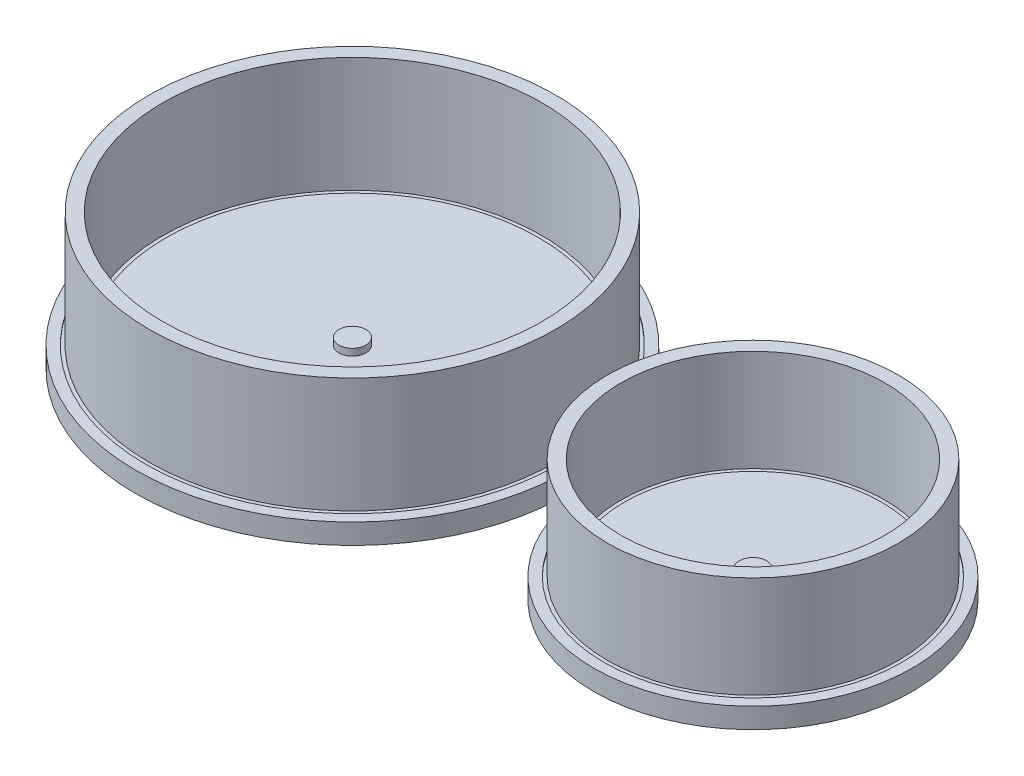
ISO-10303-21;
HEADER;
FILE_DESCRIPTION(('STEP AP214'),'2;1');
FILE_NAME('part.step','',(''),(''),'','','');
FILE_SCHEMA(('AUTOMOTIVE_DESIGN { 1 0 10303 214 1 1 1 1 }'));
ENDSEC;
DATA;
#1=APPLICATION_CONTEXT('core data for automotive mechanical design processes');
#2=APPLICATION_PROTOCOL_DEFINITION('international standard','automotive_design',2000,#1);
#3=PRODUCT_CONTEXT('',#1,'mechanical');
#4=PRODUCT('Part','Part','',(#3));
#5=PRODUCT_RELATED_PRODUCT_CATEGORY('part','',(#4));
#6=PRODUCT_DEFINITION_FORMATION('','',#4);
#7=PRODUCT_DEFINITION_CONTEXT('part definition',#1,'design');
#8=PRODUCT_DEFINITION('design','',#6,#7);
#9=PRODUCT_DEFINITION_SHAPE('','',#8);
#10=(LENGTH_UNIT() NAMED_UNIT(*) SI_UNIT(.MILLI.,.METRE.));
#11=(NAMED_UNIT(*) PLANE_ANGLE_UNIT() SI_UNIT($,.RADIAN.));
#12=(NAMED_UNIT(*) SI_UNIT($,.STERADIAN.) SOLID_ANGLE_UNIT());
#13=UNCERTAINTY_MEASURE_WITH_UNIT(LENGTH_MEASURE(1.E-05),#10,'distance_accuracy_value','');
#14=(GEOMETRIC_REPRESENTATION_CONTEXT(3) GLOBAL_UNCERTAINTY_ASSIGNED_CONTEXT((#13)) GLOBAL_UNIT_ASSIGNED_CONTEXT((#10,
#11,#12)) REPRESENTATION_CONTEXT('',''));
#15=CARTESIAN_POINT('',(0.,0.,0.));
#16=DIRECTION('',(0.,0.,1.));
#17=DIRECTION('',(1.,0.,0.));
#18=AXIS2_PLACEMENT_3D('',#15,#16,#17);
#19=CARTESIAN_POINT('',(59.14982176278,4.,0.));
#20=DIRECTION('',(0.,-1.,0.));
#21=DIRECTION('',(0.,0.,-1.));
#22=AXIS2_PLACEMENT_3D('',#19,#20,#21);
#23=CYLINDRICAL_SURFACE('',#22,2.);
#24=CARTESIAN_POINT('',(59.14982176278,4.,0.));
#25=DIRECTION('',(0.,1.,0.));
#26=DIRECTION('',(0.,0.,1.));
#27=AXIS2_PLACEMENT_3D('',#24,#25,#26);
#28=CIRCLE('',#27,2.);
#29=CARTESIAN_POINT('',(59.14982176278,4.,2.));
#30=VERTEX_POINT('',#29);
#31=EDGE_CURVE('E11',#30,#30,#28,.T.);
#32=ORIENTED_EDGE('',*,*,#31,.F.);
#33=EDGE_LOOP('',(#32));
#34=FACE_BOUND('',#33,.T.);
#35=CARTESIAN_POINT('',(59.14982176278,3.,0.));
#36=DIRECTION('',(0.,1.,0.));
#37=DIRECTION('',(0.,0.,1.));
#38=AXIS2_PLACEMENT_3D('',#35,#36,#37);
#39=CIRCLE('',#38,2.);
#40=CARTESIAN_POINT('',(59.14982176278,3.,2.));
#41=VERTEX_POINT('',#40);
#42=EDGE_CURVE('E42',#41,#41,#39,.T.);
#43=ORIENTED_EDGE('',*,*,#42,.T.);
#44=EDGE_LOOP('',(#43));
#45=FACE_BOUND('',#44,.T.);
#46=ADVANCED_FACE('F39',(#34,#45),#23,.T.);
#47=CARTESIAN_POINT('',(59.14982176278,4.,0.));
#48=DIRECTION('',(0.,1.,0.));
#49=DIRECTION('',(0.,0.,1.));
#50=AXIS2_PLACEMENT_3D('',#47,#48,#49);
#51=PLANE('',#50);
#52=ORIENTED_EDGE('',*,*,#31,.T.);
#53=EDGE_LOOP('',(#52));
#54=FACE_BOUND('',#53,.T.);
#55=ADVANCED_FACE('F54',(#54),#51,.T.);
#56=CARTESIAN_POINT('',(59.14982176278,3.,0.));
#57=DIRECTION('',(0.,1.,0.));
#58=DIRECTION('',(0.,0.,1.));
#59=AXIS2_PLACEMENT_3D('',#56,#57,#58);
#60=PLANE('',#59);
#61=ORIENTED_EDGE('',*,*,#42,.F.);
#62=EDGE_LOOP('',(#61));
#63=FACE_BOUND('',#62,.T.);
#64=ADVANCED_FACE('F52',(#63),#60,.F.);
#65=CLOSED_SHELL('',(#46,#55,#64));
#66=MANIFOLD_SOLID_BREP('B2',#65);
#67=CARTESIAN_POINT('',(59.14982176278,20.,0.));
#68=DIRECTION('',(0.,-1.,0.));
#69=DIRECTION('',(0.,0.,-1.));
#70=AXIS2_PLACEMENT_3D('',#67,#68,#69);
#71=CYLINDRICAL_SURFACE('',#70,21.5);
#72=CARTESIAN_POINT('',(59.14982176278,3.,0.));
#73=DIRECTION('',(0.,1.,0.));
#74=DIRECTION('',(0.,0.,1.));
#75=AXIS2_PLACEMENT_3D('',#72,#73,#74);
#76=CIRCLE('',#75,21.5);
#77=CARTESIAN_POINT('',(59.14982176278,3.,21.5));
#78=VERTEX_POINT('',#77);
#79=EDGE_CURVE('E38',#78,#78,#76,.T.);
#80=ORIENTED_EDGE('',*,*,#79,.T.);
#81=EDGE_LOOP('',(#80));
#82=FACE_BOUND('',#81,.T.);
#83=CARTESIAN_POINT('',(59.14982176278,18.,0.));
#84=DIRECTION('',(0.,1.,0.));
#85=DIRECTION('',(0.,0.,1.));
#86=AXIS2_PLACEMENT_3D('',#83,#84,#85);
#87=CIRCLE('',#86,21.5);
#88=CARTESIAN_POINT('',(59.14982176278,18.,21.5));
#89=VERTEX_POINT('',#88);
#90=EDGE_CURVE('E98',#89,#89,#87,.T.);
#91=ORIENTED_EDGE('',*,*,#90,.F.);
#92=EDGE_LOOP('',(#91));
#93=FACE_BOUND('',#92,.T.);
#94=ADVANCED_FACE('F87',(#82,#93),#71,.T.);
#95=CARTESIAN_POINT('',(59.14982176278,20.,0.));
#96=DIRECTION('',(0.,-1.,0.));
#97=DIRECTION('',(0.,0.,-1.));
#98=AXIS2_PLACEMENT_3D('',#95,#96,#97);
#99=CYLINDRICAL_SURFACE('',#98,19.5);
#100=CARTESIAN_POINT('',(59.14982176278,3.,0.));
#101=DIRECTION('',(0.,1.,0.));
#102=DIRECTION('',(0.,0.,1.));
#103=AXIS2_PLACEMENT_3D('',#100,#101,#102);
#104=CIRCLE('',#103,19.5);
#105=CARTESIAN_POINT('',(59.14982176278,3.,19.5));
#106=VERTEX_POINT('',#105);
#107=EDGE_CURVE('E94',#106,#106,#104,.T.);
#108=ORIENTED_EDGE('',*,*,#107,.F.);
#109=EDGE_LOOP('',(#108));
#110=FACE_BOUND('',#109,.T.);
#111=CARTESIAN_POINT('',(59.14982176278,18.,0.));
#112=DIRECTION('',(0.,1.,0.));
#113=DIRECTION('',(0.,0.,1.));
#114=AXIS2_PLACEMENT_3D('',#111,#112,#113);
#115=CIRCLE('',#114,19.5);
#116=CARTESIAN_POINT('',(59.14982176278,18.,19.5));
#117=VERTEX_POINT('',#116);
#118=EDGE_CURVE('E90',#117,#117,#115,.T.);
#119=ORIENTED_EDGE('',*,*,#118,.T.);
#120=EDGE_LOOP('',(#119));
#121=FACE_BOUND('',#120,.T.);
#122=ADVANCED_FACE('F107',(#110,#121),#99,.F.);
#123=CARTESIAN_POINT('',(59.14982176278,3.,0.));
#124=DIRECTION('',(0.,1.,0.));
#125=DIRECTION('',(0.,0.,1.));
#126=AXIS2_PLACEMENT_3D('',#123,#124,#125);
#127=PLANE('',#126);
#128=ORIENTED_EDGE('',*,*,#79,.F.);
#129=EDGE_LOOP('',(#128));
#130=FACE_BOUND('',#129,.T.);
#131=ORIENTED_EDGE('',*,*,#107,.T.);
#132=EDGE_LOOP('',(#131));
#133=FACE_BOUND('',#132,.T.);
#134=ADVANCED_FACE('F111',(#130,#133),#127,.F.);
#135=CARTESIAN_POINT('',(59.14982176278,18.,0.));
#136=DIRECTION('',(0.,1.,0.));
#137=DIRECTION('',(0.,0.,1.));
#138=AXIS2_PLACEMENT_3D('',#135,#136,#137);
#139=PLANE('',#138);
#140=ORIENTED_EDGE('',*,*,#118,.F.);
#141=EDGE_LOOP('',(#140));
#142=FACE_BOUND('',#141,.T.);
#143=ORIENTED_EDGE('',*,*,#90,.T.);
#144=EDGE_LOOP('',(#143));
#145=FACE_BOUND('',#144,.T.);
#146=ADVANCED_FACE('F109',(#142,#145),#139,.T.);
#147=CLOSED_SHELL('',(#94,#122,#134,#146));
#148=MANIFOLD_SOLID_BREP('B6',#147);
#149=CARTESIAN_POINT('',(0.,20.,0.));
#150=DIRECTION('',(0.,1.,0.));
#151=DIRECTION('',(0.,0.,1.));
#152=AXIS2_PLACEMENT_3D('',#149,#150,#151);
#153=PLANE('',#152);
#154=CARTESIAN_POINT('',(0.,20.,0.));
#155=DIRECTION('',(0.,1.,0.));
#156=DIRECTION('',(0.,0.,1.));
#157=AXIS2_PLACEMENT_3D('',#154,#155,#156);
#158=CIRCLE('',#157,30.);
#159=CARTESIAN_POINT('',(0.,20.,30.));
#160=VERTEX_POINT('',#159);
#161=EDGE_CURVE('E86',#160,#160,#158,.T.);
#162=ORIENTED_EDGE('',*,*,#161,.T.);
#163=EDGE_LOOP('',(#162));
#164=FACE_BOUND('',#163,.T.);
#165=CARTESIAN_POINT('',(0.,20.,0.));
#166=DIRECTION('',(0.,1.,0.));
#167=DIRECTION('',(0.,0.,1.));
#168=AXIS2_PLACEMENT_3D('',#165,#166,#167);
#169=CIRCLE('',#168,28.);
#170=CARTESIAN_POINT('',(0.,20.,28.));
#171=VERTEX_POINT('',#170);
#172=EDGE_CURVE('E167',#171,#171,#169,.T.);
#173=ORIENTED_EDGE('',*,*,#172,.F.);
#174=EDGE_LOOP('',(#173));
#175=FACE_BOUND('',#174,.T.);
#176=ADVANCED_FACE('F156',(#164,#175),#153,.T.);
#177=CARTESIAN_POINT('',(0.,3.,0.));
#178=DIRECTION('',(0.,1.,0.));
#179=DIRECTION('',(0.,0.,1.));
#180=AXIS2_PLACEMENT_3D('',#177,#178,#179);
#181=PLANE('',#180);
#182=CARTESIAN_POINT('',(0.,3.,0.));
#183=DIRECTION('',(0.,1.,0.));
#184=DIRECTION('',(0.,0.,1.));
#185=AXIS2_PLACEMENT_3D('',#182,#183,#184);
#186=CIRCLE('',#185,30.);
#187=CARTESIAN_POINT('',(0.,3.,30.));
#188=VERTEX_POINT('',#187);
#189=EDGE_CURVE('E160',#188,#188,#186,.T.);
#190=ORIENTED_EDGE('',*,*,#189,.F.);
#191=EDGE_LOOP('',(#190));
#192=FACE_BOUND('',#191,.T.);
#193=CARTESIAN_POINT('',(0.,3.,0.));
#194=DIRECTION('',(0.,1.,0.));
#195=DIRECTION('',(0.,0.,1.));
#196=AXIS2_PLACEMENT_3D('',#193,#194,#195);
#197=CIRCLE('',#196,28.);
#198=CARTESIAN_POINT('',(0.,3.,28.));
#199=VERTEX_POINT('',#198);
#200=EDGE_CURVE('E169',#199,#199,#197,.T.);
#201=ORIENTED_EDGE('',*,*,#200,.T.);
#202=EDGE_LOOP('',(#201));
#203=FACE_BOUND('',#202,.T.);
#204=ADVANCED_FACE('F179',(#192,#203),#181,.F.);
#205=CARTESIAN_POINT('',(0.,20.,0.));
#206=DIRECTION('',(0.,-1.,0.));
#207=DIRECTION('',(0.,0.,-1.));
#208=AXIS2_PLACEMENT_3D('',#205,#206,#207);
#209=CYLINDRICAL_SURFACE('',#208,30.);
#210=ORIENTED_EDGE('',*,*,#161,.F.);
#211=EDGE_LOOP('',(#210));
#212=FACE_BOUND('',#211,.T.);
#213=ORIENTED_EDGE('',*,*,#189,.T.);
#214=EDGE_LOOP('',(#213));
#215=FACE_BOUND('',#214,.T.);
#216=ADVANCED_FACE('F158',(#212,#215),#209,.T.);
#217=CARTESIAN_POINT('',(0.,20.,0.));
#218=DIRECTION('',(0.,-1.,0.));
#219=DIRECTION('',(0.,0.,-1.));
#220=AXIS2_PLACEMENT_3D('',#217,#218,#219);
#221=CYLINDRICAL_SURFACE('',#220,28.);
#222=ORIENTED_EDGE('',*,*,#172,.T.);
#223=EDGE_LOOP('',(#222));
#224=FACE_BOUND('',#223,.T.);
#225=ORIENTED_EDGE('',*,*,#200,.F.);
#226=EDGE_LOOP('',(#225));
#227=FACE_BOUND('',#226,.T.);
#228=ADVANCED_FACE('F175',(#224,#227),#221,.F.);
#229=CLOSED_SHELL('',(#176,#204,#216,#228));
#230=MANIFOLD_SOLID_BREP('B33',#229);
#231=CARTESIAN_POINT('',(59.14982176278,3.,0.));
#232=DIRECTION('',(0.,-1.,0.));
#233=DIRECTION('',(0.,0.,-1.));
#234=AXIS2_PLACEMENT_3D('',#231,#232,#233);
#235=CYLINDRICAL_SURFACE('',#234,23.5);
#236=CARTESIAN_POINT('',(59.14982176278,3.,0.));
#237=DIRECTION('',(0.,1.,0.));
#238=DIRECTION('',(0.,0.,1.));
#239=AXIS2_PLACEMENT_3D('',#236,#237,#238);
#240=CIRCLE('',#239,23.5);
#241=CARTESIAN_POINT('',(59.14982176278,3.,23.5));
#242=VERTEX_POINT('',#241);
#243=EDGE_CURVE('E155',#242,#242,#240,.T.);
#244=ORIENTED_EDGE('',*,*,#243,.F.);
#245=EDGE_LOOP('',(#244));
#246=FACE_BOUND('',#245,.T.);
#247=CARTESIAN_POINT('',(59.14982176278,0.,0.));
#248=DIRECTION('',(0.,1.,0.));
#249=DIRECTION('',(0.,0.,1.));
#250=AXIS2_PLACEMENT_3D('',#247,#248,#249);
#251=CIRCLE('',#250,23.5);
#252=CARTESIAN_POINT('',(59.14982176278,0.,23.5));
#253=VERTEX_POINT('',#252);
#254=EDGE_CURVE('E227',#253,#253,#251,.T.);
#255=ORIENTED_EDGE('',*,*,#254,.T.);
#256=EDGE_LOOP('',(#255));
#257=FACE_BOUND('',#256,.T.);
#258=ADVANCED_FACE('F224',(#246,#257),#235,.T.);
#259=CARTESIAN_POINT('',(59.14982176278,3.,0.));
#260=DIRECTION('',(0.,1.,0.));
#261=DIRECTION('',(0.,0.,1.));
#262=AXIS2_PLACEMENT_3D('',#259,#260,#261);
#263=PLANE('',#262);
#264=CARTESIAN_POINT('',(59.14982176278,3.,0.));
#265=DIRECTION('',(0.,1.,0.));
#266=DIRECTION('',(0.,0.,1.));
#267=AXIS2_PLACEMENT_3D('',#264,#265,#266);
#268=CIRCLE('',#267,22.);
#269=CARTESIAN_POINT('',(59.14982176278,3.,22.));
#270=VERTEX_POINT('',#269);
#271=EDGE_CURVE('E236',#270,#270,#268,.T.);
#272=ORIENTED_EDGE('',*,*,#271,.F.);
#273=EDGE_LOOP('',(#272));
#274=FACE_BOUND('',#273,.T.);
#275=ORIENTED_EDGE('',*,*,#243,.T.);
#276=EDGE_LOOP('',(#275));
#277=FACE_BOUND('',#276,.T.);
#278=ADVANCED_FACE('F264',(#274,#277),#263,.T.);
#279=CARTESIAN_POINT('',(59.14982176278,0.,0.));
#280=DIRECTION('',(0.,1.,0.));
#281=DIRECTION('',(0.,0.,1.));
#282=AXIS2_PLACEMENT_3D('',#279,#280,#281);
#283=PLANE('',#282);
#284=ORIENTED_EDGE('',*,*,#254,.F.);
#285=EDGE_LOOP('',(#284));
#286=FACE_BOUND('',#285,.T.);
#287=ADVANCED_FACE('F260',(#286),#283,.F.);
#288=CARTESIAN_POINT('',(59.14982176278,2.8,0.));
#289=DIRECTION('',(0.,1.,0.));
#290=DIRECTION('',(0.,0.,1.));
#291=AXIS2_PLACEMENT_3D('',#288,#289,#290);
#292=CYLINDRICAL_SURFACE('',#291,22.);
#293=CARTESIAN_POINT('',(59.14982176278,2.8,0.));
#294=DIRECTION('',(0.,1.,0.));
#295=DIRECTION('',(0.,0.,1.));
#296=AXIS2_PLACEMENT_3D('',#293,#294,#295);
#297=CIRCLE('',#296,22.);
#298=CARTESIAN_POINT('',(59.14982176278,2.8,22.));
#299=VERTEX_POINT('',#298);
#300=EDGE_CURVE('E234',#299,#299,#297,.T.);
#301=ORIENTED_EDGE('',*,*,#300,.F.);
#302=EDGE_LOOP('',(#301));
#303=FACE_BOUND('',#302,.T.);
#304=ORIENTED_EDGE('',*,*,#271,.T.);
#305=EDGE_LOOP('',(#304));
#306=FACE_BOUND('',#305,.T.);
#307=ADVANCED_FACE('F254',(#303,#306),#292,.F.);
#308=CARTESIAN_POINT('',(59.14982176278,2.8,0.));
#309=DIRECTION('',(0.,1.,0.));
#310=DIRECTION('',(0.,0.,1.));
#311=AXIS2_PLACEMENT_3D('',#308,#309,#310);
#312=PLANE('',#311);
#313=CARTESIAN_POINT('',(59.14982176278,2.8,0.));
#314=DIRECTION('',(0.,1.,0.));
#315=DIRECTION('',(0.,0.,1.));
#316=AXIS2_PLACEMENT_3D('',#313,#314,#315);
#317=CIRCLE('',#316,19.);
#318=CARTESIAN_POINT('',(59.14982176278,2.8,19.));
#319=VERTEX_POINT('',#318);
#320=EDGE_CURVE('E239',#319,#319,#317,.T.);
#321=ORIENTED_EDGE('',*,*,#320,.F.);
#322=EDGE_LOOP('',(#321));
#323=FACE_BOUND('',#322,.T.);
#324=ORIENTED_EDGE('',*,*,#300,.T.);
#325=EDGE_LOOP('',(#324));
#326=FACE_BOUND('',#325,.T.);
#327=ADVANCED_FACE('F251',(#323,#326),#312,.T.);
#328=CARTESIAN_POINT('',(59.14982176278,2.8,0.));
#329=DIRECTION('',(0.,1.,0.));
#330=DIRECTION('',(0.,0.,1.));
#331=AXIS2_PLACEMENT_3D('',#328,#329,#330);
#332=CYLINDRICAL_SURFACE('',#331,19.);
#333=ORIENTED_EDGE('',*,*,#320,.T.);
#334=EDGE_LOOP('',(#333));
#335=FACE_BOUND('',#334,.T.);
#336=CARTESIAN_POINT('',(59.14982176278,3.,0.));
#337=DIRECTION('',(0.,1.,0.));
#338=DIRECTION('',(0.,0.,1.));
#339=AXIS2_PLACEMENT_3D('',#336,#337,#338);
#340=CIRCLE('',#339,19.);
#341=CARTESIAN_POINT('',(59.14982176278,3.,19.));
#342=VERTEX_POINT('',#341);
#343=EDGE_CURVE('E242',#342,#342,#340,.T.);
#344=ORIENTED_EDGE('',*,*,#343,.F.);
#345=EDGE_LOOP('',(#344));
#346=FACE_BOUND('',#345,.T.);
#347=ADVANCED_FACE('F248',(#335,#346),#332,.T.);
#348=ORIENTED_EDGE('',*,*,#343,.T.);
#349=EDGE_LOOP('',(#348));
#350=FACE_BOUND('',#349,.T.);
#351=ADVANCED_FACE('F267',(#350),#263,.T.);
#352=CLOSED_SHELL('',(#258,#278,#287,#307,#327,#347,#351));
#353=MANIFOLD_SOLID_BREP('B81',#352);
#354=CARTESIAN_POINT('',(0.,3.,0.));
#355=DIRECTION('',(0.,-1.,0.));
#356=DIRECTION('',(0.,0.,-1.));
#357=AXIS2_PLACEMENT_3D('',#354,#355,#356);
#358=CYLINDRICAL_SURFACE('',#357,32.);
#359=CARTESIAN_POINT('',(0.,3.,0.));
#360=DIRECTION('',(0.,1.,0.));
#361=DIRECTION('',(0.,0.,1.));
#362=AXIS2_PLACEMENT_3D('',#359,#360,#361);
#363=CIRCLE('',#362,32.);
#364=CARTESIAN_POINT('',(0.,3.,32.));
#365=VERTEX_POINT('',#364);
#366=EDGE_CURVE('E223',#365,#365,#363,.T.);
#367=ORIENTED_EDGE('',*,*,#366,.F.);
#368=EDGE_LOOP('',(#367));
#369=FACE_BOUND('',#368,.T.);
#370=CARTESIAN_POINT('',(0.,0.,0.));
#371=DIRECTION('',(0.,1.,0.));
#372=DIRECTION('',(0.,0.,1.));
#373=AXIS2_PLACEMENT_3D('',#370,#371,#372);
#374=CIRCLE('',#373,32.);
#375=CARTESIAN_POINT('',(0.,0.,32.));
#376=VERTEX_POINT('',#375);
#377=EDGE_CURVE('E326',#376,#376,#374,.T.);
#378=ORIENTED_EDGE('',*,*,#377,.T.);
#379=EDGE_LOOP('',(#378));
#380=FACE_BOUND('',#379,.T.);
#381=ADVANCED_FACE('F323',(#369,#380),#358,.T.);
#382=CARTESIAN_POINT('',(0.,3.,0.));
#383=DIRECTION('',(0.,1.,0.));
#384=DIRECTION('',(0.,0.,1.));
#385=AXIS2_PLACEMENT_3D('',#382,#383,#384);
#386=PLANE('',#385);
#387=CARTESIAN_POINT('',(0.,3.,0.));
#388=DIRECTION('',(0.,1.,0.));
#389=DIRECTION('',(0.,0.,1.));
#390=AXIS2_PLACEMENT_3D('',#387,#388,#389);
#391=CIRCLE('',#390,30.5);
#392=CARTESIAN_POINT('',(0.,3.,30.5));
#393=VERTEX_POINT('',#392);
#394=EDGE_CURVE('E335',#393,#393,#391,.T.);
#395=ORIENTED_EDGE('',*,*,#394,.F.);
#396=EDGE_LOOP('',(#395));
#397=FACE_BOUND('',#396,.T.);
#398=ORIENTED_EDGE('',*,*,#366,.T.);
#399=EDGE_LOOP('',(#398));
#400=FACE_BOUND('',#399,.T.);
#401=ADVANCED_FACE('F366',(#397,#400),#386,.T.);
#402=CARTESIAN_POINT('',(0.,0.,0.));
#403=DIRECTION('',(0.,1.,0.));
#404=DIRECTION('',(0.,0.,1.));
#405=AXIS2_PLACEMENT_3D('',#402,#403,#404);
#406=PLANE('',#405);
#407=ORIENTED_EDGE('',*,*,#377,.F.);
#408=EDGE_LOOP('',(#407));
#409=FACE_BOUND('',#408,.T.);
#410=ADVANCED_FACE('F384',(#409),#406,.F.);
#411=CARTESIAN_POINT('',(0.,2.8,0.));
#412=DIRECTION('',(0.,1.,0.));
#413=DIRECTION('',(0.,0.,1.));
#414=AXIS2_PLACEMENT_3D('',#411,#412,#413);
#415=CYLINDRICAL_SURFACE('',#414,30.5);
#416=CARTESIAN_POINT('',(0.,2.8,0.));
#417=DIRECTION('',(0.,1.,0.));
#418=DIRECTION('',(0.,0.,1.));
#419=AXIS2_PLACEMENT_3D('',#416,#417,#418);
#420=CIRCLE('',#419,30.5);
#421=CARTESIAN_POINT('',(0.,2.8,30.5));
#422=VERTEX_POINT('',#421);
#423=EDGE_CURVE('E333',#422,#422,#420,.T.);
#424=ORIENTED_EDGE('',*,*,#423,.F.);
#425=EDGE_LOOP('',(#424));
#426=FACE_BOUND('',#425,.T.);
#427=ORIENTED_EDGE('',*,*,#394,.T.);
#428=EDGE_LOOP('',(#427));
#429=FACE_BOUND('',#428,.T.);
#430=ADVANCED_FACE('F376',(#426,#429),#415,.F.);
#431=CARTESIAN_POINT('',(0.,2.8,0.));
#432=DIRECTION('',(0.,1.,0.));
#433=DIRECTION('',(0.,0.,1.));
#434=AXIS2_PLACEMENT_3D('',#431,#432,#433);
#435=PLANE('',#434);
#436=CARTESIAN_POINT('',(0.,2.8,0.));
#437=DIRECTION('',(0.,1.,0.));
#438=DIRECTION('',(0.,0.,1.));
#439=AXIS2_PLACEMENT_3D('',#436,#437,#438);
#440=CIRCLE('',#439,27.5);
#441=CARTESIAN_POINT('',(0.,2.8,27.5));
#442=VERTEX_POINT('',#441);
#443=EDGE_CURVE('E338',#442,#442,#440,.T.);
#444=ORIENTED_EDGE('',*,*,#443,.F.);
#445=EDGE_LOOP('',(#444));
#446=FACE_BOUND('',#445,.T.);
#447=ORIENTED_EDGE('',*,*,#423,.T.);
#448=EDGE_LOOP('',(#447));
#449=FACE_BOUND('',#448,.T.);
#450=ADVANCED_FACE('F370',(#446,#449),#435,.T.);
#451=CARTESIAN_POINT('',(0.,2.8,0.));
#452=DIRECTION('',(0.,1.,0.));
#453=DIRECTION('',(0.,0.,1.));
#454=AXIS2_PLACEMENT_3D('',#451,#452,#453);
#455=CYLINDRICAL_SURFACE('',#454,27.5);
#456=ORIENTED_EDGE('',*,*,#443,.T.);
#457=EDGE_LOOP('',(#456));
#458=FACE_BOUND('',#457,.T.);
#459=CARTESIAN_POINT('',(0.,3.,0.));
#460=DIRECTION('',(0.,1.,0.));
#461=DIRECTION('',(0.,0.,1.));
#462=AXIS2_PLACEMENT_3D('',#459,#460,#461);
#463=CIRCLE('',#462,27.5);
#464=CARTESIAN_POINT('',(0.,3.,27.5));
#465=VERTEX_POINT('',#464);
#466=EDGE_CURVE('E341',#465,#465,#463,.T.);
#467=ORIENTED_EDGE('',*,*,#466,.F.);
#468=EDGE_LOOP('',(#467));
#469=FACE_BOUND('',#468,.T.);
#470=ADVANCED_FACE('F364',(#458,#469),#455,.T.);
#471=CARTESIAN_POINT('',(0.,3.,0.));
#472=DIRECTION('',(0.,1.,0.));
#473=DIRECTION('',(0.,0.,1.));
#474=AXIS2_PLACEMENT_3D('',#471,#472,#473);
#475=CIRCLE('',#474,2.);
#476=CARTESIAN_POINT('',(0.,3.,2.));
#477=VERTEX_POINT('',#476);
#478=EDGE_CURVE('E347',#477,#477,#475,.T.);
#479=ORIENTED_EDGE('',*,*,#478,.F.);
#480=EDGE_LOOP('',(#479));
#481=FACE_BOUND('',#480,.T.);
#482=ORIENTED_EDGE('',*,*,#466,.T.);
#483=EDGE_LOOP('',(#482));
#484=FACE_BOUND('',#483,.T.);
#485=ADVANCED_FACE('F358',(#481,#484),#386,.T.);
#486=CARTESIAN_POINT('',(0.,4.,0.));
#487=DIRECTION('',(0.,-1.,0.));
#488=DIRECTION('',(0.,0.,-1.));
#489=AXIS2_PLACEMENT_3D('',#486,#487,#488);
#490=CYLINDRICAL_SURFACE('',#489,2.);
#491=CARTESIAN_POINT('',(0.,4.,0.));
#492=DIRECTION('',(0.,1.,0.));
#493=DIRECTION('',(0.,0.,1.));
#494=AXIS2_PLACEMENT_3D('',#491,#492,#493);
#495=CIRCLE('',#494,2.);
#496=CARTESIAN_POINT('',(0.,4.,2.));
#497=VERTEX_POINT('',#496);
#498=EDGE_CURVE('E344',#497,#497,#495,.T.);
#499=ORIENTED_EDGE('',*,*,#498,.F.);
#500=EDGE_LOOP('',(#499));
#501=FACE_BOUND('',#500,.T.);
#502=ORIENTED_EDGE('',*,*,#478,.T.);
#503=EDGE_LOOP('',(#502));
#504=FACE_BOUND('',#503,.T.);
#505=ADVANCED_FACE('F355',(#501,#504),#490,.T.);
#506=CARTESIAN_POINT('',(0.,4.,0.));
#507=DIRECTION('',(0.,1.,0.));
#508=DIRECTION('',(0.,0.,1.));
#509=AXIS2_PLACEMENT_3D('',#506,#507,#508);
#510=PLANE('',#509);
#511=ORIENTED_EDGE('',*,*,#498,.T.);
#512=EDGE_LOOP('',(#511));
#513=FACE_BOUND('',#512,.T.);
#514=ADVANCED_FACE('F353',(#513),#510,.T.);
#515=CLOSED_SHELL('',(#381,#401,#410,#430,#450,#470,#485,#505,#514));
#516=MANIFOLD_SOLID_BREP('B150',#515);
#517=ADVANCED_BREP_SHAPE_REPRESENTATION('',(#18,#66,#148,#230,#353,#516),#14);
#518=SHAPE_DEFINITION_REPRESENTATION(#9,#517);
ENDSEC;
END-ISO-10303-21;
